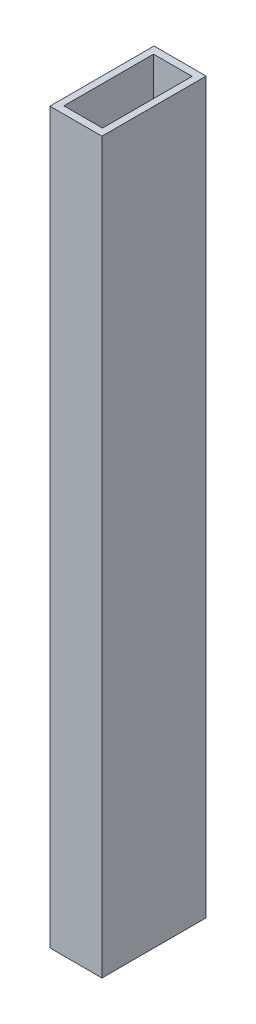
ISO-10303-21;
HEADER;
FILE_DESCRIPTION(('STEP AP214'),'2;1');
FILE_NAME('part.step','',(''),(''),'','','');
FILE_SCHEMA(('AUTOMOTIVE_DESIGN { 1 0 10303 214 1 1 1 1 }'));
ENDSEC;
DATA;
#1=APPLICATION_CONTEXT('core data for automotive mechanical design processes');
#2=APPLICATION_PROTOCOL_DEFINITION('international standard','automotive_design',2000,#1);
#3=PRODUCT_CONTEXT('',#1,'mechanical');
#4=PRODUCT('Part','Part','',(#3));
#5=PRODUCT_RELATED_PRODUCT_CATEGORY('part','',(#4));
#6=PRODUCT_DEFINITION_FORMATION('','',#4);
#7=PRODUCT_DEFINITION_CONTEXT('part definition',#1,'design');
#8=PRODUCT_DEFINITION('design','',#6,#7);
#9=PRODUCT_DEFINITION_SHAPE('','',#8);
#10=(LENGTH_UNIT() NAMED_UNIT(*) SI_UNIT(.MILLI.,.METRE.));
#11=(NAMED_UNIT(*) PLANE_ANGLE_UNIT() SI_UNIT($,.RADIAN.));
#12=(NAMED_UNIT(*) SI_UNIT($,.STERADIAN.) SOLID_ANGLE_UNIT());
#13=UNCERTAINTY_MEASURE_WITH_UNIT(LENGTH_MEASURE(1.E-05),#10,'distance_accuracy_value','');
#14=(GEOMETRIC_REPRESENTATION_CONTEXT(3) GLOBAL_UNCERTAINTY_ASSIGNED_CONTEXT((#13)) GLOBAL_UNIT_ASSIGNED_CONTEXT((#10,
#11,#12)) REPRESENTATION_CONTEXT('',''));
#15=CARTESIAN_POINT('',(0.,0.,0.));
#16=DIRECTION('',(0.,0.,1.));
#17=DIRECTION('',(1.,0.,0.));
#18=AXIS2_PLACEMENT_3D('',#15,#16,#17);
#19=CARTESIAN_POINT('',(0.,177.8,0.));
#20=DIRECTION('',(0.,1.,0.));
#21=DIRECTION('',(0.,0.,1.));
#22=AXIS2_PLACEMENT_3D('',#19,#20,#21);
#23=PLANE('',#22);
#24=DIRECTION('',(0.,0.,1.));
#25=VECTOR('',#24,1.);
#26=CARTESIAN_POINT('',(0.,177.8,-25.4));
#27=LINE('',#26,#25);
#28=CARTESIAN_POINT('',(0.,177.8,-25.4));
#29=VERTEX_POINT('',#28);
#30=CARTESIAN_POINT('',(0.,177.8,0.));
#31=VERTEX_POINT('',#30);
#32=EDGE_CURVE('E142',#29,#31,#27,.T.);
#33=ORIENTED_EDGE('',*,*,#32,.T.);
#34=DIRECTION('',(1.,0.,0.));
#35=VECTOR('',#34,1.);
#36=CARTESIAN_POINT('',(0.,177.8,0.));
#37=LINE('',#36,#35);
#38=CARTESIAN_POINT('',(12.7,177.8,0.));
#39=VERTEX_POINT('',#38);
#40=EDGE_CURVE('E145',#31,#39,#37,.T.);
#41=ORIENTED_EDGE('',*,*,#40,.T.);
#42=DIRECTION('',(0.,0.,-1.));
#43=VECTOR('',#42,1.);
#44=CARTESIAN_POINT('',(12.7,177.8,0.));
#45=LINE('',#44,#43);
#46=CARTESIAN_POINT('',(12.7,177.8,-25.4));
#47=VERTEX_POINT('',#46);
#48=EDGE_CURVE('E148',#39,#47,#45,.T.);
#49=ORIENTED_EDGE('',*,*,#48,.T.);
#50=DIRECTION('',(-1.,0.,0.));
#51=VECTOR('',#50,1.);
#52=CARTESIAN_POINT('',(0.,177.8,-25.4));
#53=LINE('',#52,#51);
#54=EDGE_CURVE('E150',#47,#29,#53,.T.);
#55=ORIENTED_EDGE('',*,*,#54,.T.);
#56=EDGE_LOOP('',(#33,#41,#49,#55));
#57=FACE_BOUND('',#56,.T.);
#58=DIRECTION('',(0.,0.,1.));
#59=VECTOR('',#58,1.);
#60=CARTESIAN_POINT('',(1.651,177.8,-1.778));
#61=LINE('',#60,#59);
#62=CARTESIAN_POINT('',(1.651,177.8,-23.622));
#63=VERTEX_POINT('',#62);
#64=CARTESIAN_POINT('',(1.651,177.8,-1.778));
#65=VERTEX_POINT('',#64);
#66=EDGE_CURVE('E114',#63,#65,#61,.T.);
#67=ORIENTED_EDGE('',*,*,#66,.F.);
#68=DIRECTION('',(-1.,0.,0.));
#69=VECTOR('',#68,1.);
#70=CARTESIAN_POINT('',(1.651,177.8,-23.622));
#71=LINE('',#70,#69);
#72=CARTESIAN_POINT('',(11.049,177.8,-23.622));
#73=VERTEX_POINT('',#72);
#74=EDGE_CURVE('E106',#73,#63,#71,.T.);
#75=ORIENTED_EDGE('',*,*,#74,.F.);
#76=DIRECTION('',(0.,0.,-1.));
#77=VECTOR('',#76,1.);
#78=CARTESIAN_POINT('',(11.049,177.8,-23.622));
#79=LINE('',#78,#77);
#80=CARTESIAN_POINT('',(11.049,177.8,-1.778));
#81=VERTEX_POINT('',#80);
#82=EDGE_CURVE('E128',#81,#73,#79,.T.);
#83=ORIENTED_EDGE('',*,*,#82,.F.);
#84=DIRECTION('',(1.,0.,0.));
#85=VECTOR('',#84,1.);
#86=CARTESIAN_POINT('',(11.049,177.8,-1.778));
#87=LINE('',#86,#85);
#88=EDGE_CURVE('E126',#65,#81,#87,.T.);
#89=ORIENTED_EDGE('',*,*,#88,.F.);
#90=EDGE_LOOP('',(#67,#75,#83,#89));
#91=FACE_BOUND('',#90,.T.);
#92=ADVANCED_FACE('F41',(#57,#91),#23,.T.);
#93=CARTESIAN_POINT('',(0.,0.,0.));
#94=DIRECTION('',(0.,1.,0.));
#95=DIRECTION('',(0.,0.,1.));
#96=AXIS2_PLACEMENT_3D('',#93,#94,#95);
#97=PLANE('',#96);
#98=DIRECTION('',(0.,0.,1.));
#99=VECTOR('',#98,1.);
#100=CARTESIAN_POINT('',(0.,0.,-25.4));
#101=LINE('',#100,#99);
#102=CARTESIAN_POINT('',(0.,0.,-25.4));
#103=VERTEX_POINT('',#102);
#104=CARTESIAN_POINT('',(0.,0.,0.));
#105=VERTEX_POINT('',#104);
#106=EDGE_CURVE('E122',#103,#105,#101,.T.);
#107=ORIENTED_EDGE('',*,*,#106,.F.);
#108=DIRECTION('',(-1.,0.,0.));
#109=VECTOR('',#108,1.);
#110=CARTESIAN_POINT('',(0.,0.,-25.4));
#111=LINE('',#110,#109);
#112=CARTESIAN_POINT('',(12.7,0.,-25.4));
#113=VERTEX_POINT('',#112);
#114=EDGE_CURVE('E146',#113,#103,#111,.T.);
#115=ORIENTED_EDGE('',*,*,#114,.F.);
#116=DIRECTION('',(0.,0.,-1.));
#117=VECTOR('',#116,1.);
#118=CARTESIAN_POINT('',(12.7,0.,0.));
#119=LINE('',#118,#117);
#120=CARTESIAN_POINT('',(12.7,0.,0.));
#121=VERTEX_POINT('',#120);
#122=EDGE_CURVE('E157',#121,#113,#119,.T.);
#123=ORIENTED_EDGE('',*,*,#122,.F.);
#124=DIRECTION('',(1.,0.,0.));
#125=VECTOR('',#124,1.);
#126=CARTESIAN_POINT('',(0.,0.,0.));
#127=LINE('',#126,#125);
#128=EDGE_CURVE('E155',#105,#121,#127,.T.);
#129=ORIENTED_EDGE('',*,*,#128,.F.);
#130=EDGE_LOOP('',(#107,#115,#123,#129));
#131=FACE_BOUND('',#130,.T.);
#132=DIRECTION('',(-1.,0.,0.));
#133=VECTOR('',#132,1.);
#134=CARTESIAN_POINT('',(1.651,0.,-23.622));
#135=LINE('',#134,#133);
#136=CARTESIAN_POINT('',(11.049,0.,-23.622));
#137=VERTEX_POINT('',#136);
#138=CARTESIAN_POINT('',(1.651,0.,-23.622));
#139=VERTEX_POINT('',#138);
#140=EDGE_CURVE('E64',#137,#139,#135,.T.);
#141=ORIENTED_EDGE('',*,*,#140,.T.);
#142=DIRECTION('',(0.,0.,1.));
#143=VECTOR('',#142,1.);
#144=CARTESIAN_POINT('',(1.651,0.,-1.778));
#145=LINE('',#144,#143);
#146=CARTESIAN_POINT('',(1.651,0.,-1.778));
#147=VERTEX_POINT('',#146);
#148=EDGE_CURVE('E121',#139,#147,#145,.T.);
#149=ORIENTED_EDGE('',*,*,#148,.T.);
#150=DIRECTION('',(1.,0.,0.));
#151=VECTOR('',#150,1.);
#152=CARTESIAN_POINT('',(11.049,0.,-1.778));
#153=LINE('',#152,#151);
#154=CARTESIAN_POINT('',(11.049,0.,-1.778));
#155=VERTEX_POINT('',#154);
#156=EDGE_CURVE('E134',#147,#155,#153,.T.);
#157=ORIENTED_EDGE('',*,*,#156,.T.);
#158=DIRECTION('',(0.,0.,-1.));
#159=VECTOR('',#158,1.);
#160=CARTESIAN_POINT('',(11.049,0.,-23.622));
#161=LINE('',#160,#159);
#162=EDGE_CURVE('E115',#155,#137,#161,.T.);
#163=ORIENTED_EDGE('',*,*,#162,.T.);
#164=EDGE_LOOP('',(#141,#149,#157,#163));
#165=FACE_BOUND('',#164,.T.);
#166=ADVANCED_FACE('F175',(#131,#165),#97,.F.);
#167=CARTESIAN_POINT('',(0.,177.8,-25.4));
#168=DIRECTION('',(1.,0.,0.));
#169=DIRECTION('',(0.,0.,-1.));
#170=AXIS2_PLACEMENT_3D('',#167,#168,#169);
#171=PLANE('',#170);
#172=ORIENTED_EDGE('',*,*,#106,.T.);
#173=DIRECTION('',(0.,-1.,0.));
#174=VECTOR('',#173,1.);
#175=CARTESIAN_POINT('',(0.,177.8,0.));
#176=LINE('',#175,#174);
#177=EDGE_CURVE('E11',#31,#105,#176,.T.);
#178=ORIENTED_EDGE('',*,*,#177,.F.);
#179=ORIENTED_EDGE('',*,*,#32,.F.);
#180=DIRECTION('',(0.,-1.,0.));
#181=VECTOR('',#180,1.);
#182=CARTESIAN_POINT('',(0.,177.8,-25.4));
#183=LINE('',#182,#181);
#184=EDGE_CURVE('E152',#29,#103,#183,.T.);
#185=ORIENTED_EDGE('',*,*,#184,.T.);
#186=EDGE_LOOP('',(#172,#178,#179,#185));
#187=FACE_BOUND('',#186,.T.);
#188=ADVANCED_FACE('F43',(#187),#171,.F.);
#189=CARTESIAN_POINT('',(0.,177.8,0.));
#190=DIRECTION('',(0.,0.,-1.));
#191=DIRECTION('',(-1.,0.,0.));
#192=AXIS2_PLACEMENT_3D('',#189,#190,#191);
#193=PLANE('',#192);
#194=ORIENTED_EDGE('',*,*,#128,.T.);
#195=DIRECTION('',(0.,-1.,0.));
#196=VECTOR('',#195,1.);
#197=CARTESIAN_POINT('',(12.7,177.8,0.));
#198=LINE('',#197,#196);
#199=EDGE_CURVE('E49',#39,#121,#198,.T.);
#200=ORIENTED_EDGE('',*,*,#199,.F.);
#201=ORIENTED_EDGE('',*,*,#40,.F.);
#202=ORIENTED_EDGE('',*,*,#177,.T.);
#203=EDGE_LOOP('',(#194,#200,#201,#202));
#204=FACE_BOUND('',#203,.T.);
#205=ADVANCED_FACE('F185',(#204),#193,.F.);
#206=CARTESIAN_POINT('',(12.7,177.8,0.));
#207=DIRECTION('',(-1.,0.,0.));
#208=DIRECTION('',(0.,0.,1.));
#209=AXIS2_PLACEMENT_3D('',#206,#207,#208);
#210=PLANE('',#209);
#211=ORIENTED_EDGE('',*,*,#122,.T.);
#212=DIRECTION('',(0.,-1.,0.));
#213=VECTOR('',#212,1.);
#214=CARTESIAN_POINT('',(12.7,177.8,-25.4));
#215=LINE('',#214,#213);
#216=EDGE_CURVE('E162',#47,#113,#215,.T.);
#217=ORIENTED_EDGE('',*,*,#216,.F.);
#218=ORIENTED_EDGE('',*,*,#48,.F.);
#219=ORIENTED_EDGE('',*,*,#199,.T.);
#220=EDGE_LOOP('',(#211,#217,#218,#219));
#221=FACE_BOUND('',#220,.T.);
#222=ADVANCED_FACE('F169',(#221),#210,.F.);
#223=CARTESIAN_POINT('',(0.,177.8,-25.4));
#224=DIRECTION('',(0.,0.,1.));
#225=DIRECTION('',(1.,0.,0.));
#226=AXIS2_PLACEMENT_3D('',#223,#224,#225);
#227=PLANE('',#226);
#228=ORIENTED_EDGE('',*,*,#114,.T.);
#229=ORIENTED_EDGE('',*,*,#184,.F.);
#230=ORIENTED_EDGE('',*,*,#54,.F.);
#231=ORIENTED_EDGE('',*,*,#216,.T.);
#232=EDGE_LOOP('',(#228,#229,#230,#231));
#233=FACE_BOUND('',#232,.T.);
#234=ADVANCED_FACE('F179',(#233),#227,.F.);
#235=CARTESIAN_POINT('',(1.651,177.8,-23.622));
#236=DIRECTION('',(0.,0.,1.));
#237=DIRECTION('',(1.,0.,0.));
#238=AXIS2_PLACEMENT_3D('',#235,#236,#237);
#239=PLANE('',#238);
#240=ORIENTED_EDGE('',*,*,#140,.F.);
#241=DIRECTION('',(0.,-1.,0.));
#242=VECTOR('',#241,1.);
#243=CARTESIAN_POINT('',(11.049,177.8,-23.622));
#244=LINE('',#243,#242);
#245=EDGE_CURVE('E110',#73,#137,#244,.T.);
#246=ORIENTED_EDGE('',*,*,#245,.F.);
#247=ORIENTED_EDGE('',*,*,#74,.T.);
#248=DIRECTION('',(0.,-1.,0.));
#249=VECTOR('',#248,1.);
#250=CARTESIAN_POINT('',(1.651,177.8,-23.622));
#251=LINE('',#250,#249);
#252=EDGE_CURVE('E109',#63,#139,#251,.T.);
#253=ORIENTED_EDGE('',*,*,#252,.T.);
#254=EDGE_LOOP('',(#240,#246,#247,#253));
#255=FACE_BOUND('',#254,.T.);
#256=ADVANCED_FACE('F108',(#255),#239,.T.);
#257=CARTESIAN_POINT('',(1.651,177.8,-1.778));
#258=DIRECTION('',(1.,0.,0.));
#259=DIRECTION('',(0.,0.,-1.));
#260=AXIS2_PLACEMENT_3D('',#257,#258,#259);
#261=PLANE('',#260);
#262=ORIENTED_EDGE('',*,*,#148,.F.);
#263=ORIENTED_EDGE('',*,*,#252,.F.);
#264=ORIENTED_EDGE('',*,*,#66,.T.);
#265=DIRECTION('',(0.,-1.,0.));
#266=VECTOR('',#265,1.);
#267=CARTESIAN_POINT('',(1.651,177.8,-1.778));
#268=LINE('',#267,#266);
#269=EDGE_CURVE('E123',#65,#147,#268,.T.);
#270=ORIENTED_EDGE('',*,*,#269,.T.);
#271=EDGE_LOOP('',(#262,#263,#264,#270));
#272=FACE_BOUND('',#271,.T.);
#273=ADVANCED_FACE('F118',(#272),#261,.T.);
#274=CARTESIAN_POINT('',(11.049,177.8,-1.778));
#275=DIRECTION('',(0.,0.,-1.));
#276=DIRECTION('',(-1.,0.,0.));
#277=AXIS2_PLACEMENT_3D('',#274,#275,#276);
#278=PLANE('',#277);
#279=ORIENTED_EDGE('',*,*,#156,.F.);
#280=ORIENTED_EDGE('',*,*,#269,.F.);
#281=ORIENTED_EDGE('',*,*,#88,.T.);
#282=DIRECTION('',(0.,-1.,0.));
#283=VECTOR('',#282,1.);
#284=CARTESIAN_POINT('',(11.049,177.8,-1.778));
#285=LINE('',#284,#283);
#286=EDGE_CURVE('E56',#81,#155,#285,.T.);
#287=ORIENTED_EDGE('',*,*,#286,.T.);
#288=EDGE_LOOP('',(#279,#280,#281,#287));
#289=FACE_BOUND('',#288,.T.);
#290=ADVANCED_FACE('F208',(#289),#278,.T.);
#291=CARTESIAN_POINT('',(11.049,177.8,-23.622));
#292=DIRECTION('',(-1.,0.,0.));
#293=DIRECTION('',(0.,0.,1.));
#294=AXIS2_PLACEMENT_3D('',#291,#292,#293);
#295=PLANE('',#294);
#296=ORIENTED_EDGE('',*,*,#162,.F.);
#297=ORIENTED_EDGE('',*,*,#286,.F.);
#298=ORIENTED_EDGE('',*,*,#82,.T.);
#299=ORIENTED_EDGE('',*,*,#245,.T.);
#300=EDGE_LOOP('',(#296,#297,#298,#299));
#301=FACE_BOUND('',#300,.T.);
#302=ADVANCED_FACE('F212',(#301),#295,.T.);
#303=CLOSED_SHELL('',(#92,#166,#188,#205,#222,#234,#256,#273,#290,#302));
#304=MANIFOLD_SOLID_BREP('B2',#303);
#305=ADVANCED_BREP_SHAPE_REPRESENTATION('',(#18,#304),#14);
#306=SHAPE_DEFINITION_REPRESENTATION(#9,#305);
ENDSEC;
END-ISO-10303-21;
